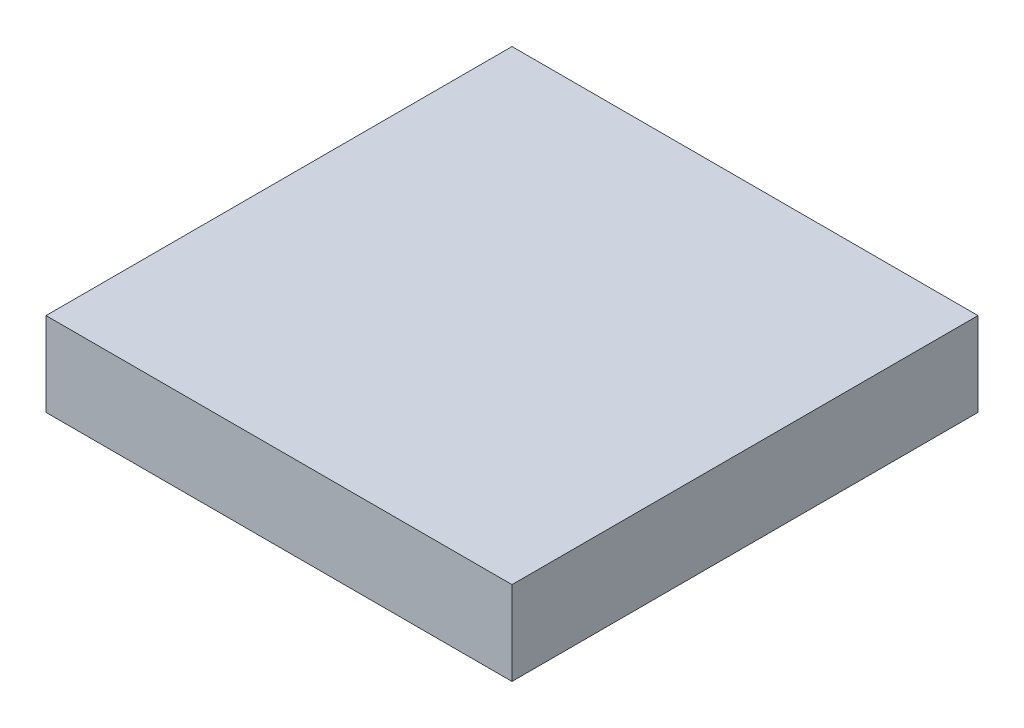
ISO-10303-21;
HEADER;
FILE_DESCRIPTION(('STEP AP214'),'2;1');
FILE_NAME('part.step','',(''),(''),'','','');
FILE_SCHEMA(('AUTOMOTIVE_DESIGN { 1 0 10303 214 1 1 1 1 }'));
ENDSEC;
DATA;
#1=APPLICATION_CONTEXT('core data for automotive mechanical design processes');
#2=APPLICATION_PROTOCOL_DEFINITION('international standard','automotive_design',2000,#1);
#3=PRODUCT_CONTEXT('',#1,'mechanical');
#4=PRODUCT('Part','Part','',(#3));
#5=PRODUCT_RELATED_PRODUCT_CATEGORY('part','',(#4));
#6=PRODUCT_DEFINITION_FORMATION('','',#4);
#7=PRODUCT_DEFINITION_CONTEXT('part definition',#1,'design');
#8=PRODUCT_DEFINITION('design','',#6,#7);
#9=PRODUCT_DEFINITION_SHAPE('','',#8);
#10=(LENGTH_UNIT() NAMED_UNIT(*) SI_UNIT(.MILLI.,.METRE.));
#11=(NAMED_UNIT(*) PLANE_ANGLE_UNIT() SI_UNIT($,.RADIAN.));
#12=(NAMED_UNIT(*) SI_UNIT($,.STERADIAN.) SOLID_ANGLE_UNIT());
#13=UNCERTAINTY_MEASURE_WITH_UNIT(LENGTH_MEASURE(1.E-05),#10,'distance_accuracy_value','');
#14=(GEOMETRIC_REPRESENTATION_CONTEXT(3) GLOBAL_UNCERTAINTY_ASSIGNED_CONTEXT((#13)) GLOBAL_UNIT_ASSIGNED_CONTEXT((#10,
#11,#12)) REPRESENTATION_CONTEXT('',''));
#15=CARTESIAN_POINT('',(0.,0.,0.));
#16=DIRECTION('',(0.,0.,1.));
#17=DIRECTION('',(1.,0.,0.));
#18=AXIS2_PLACEMENT_3D('',#15,#16,#17);
#19=CARTESIAN_POINT('',(12.5,4.5,12.5));
#20=DIRECTION('',(-1.,0.,0.));
#21=DIRECTION('',(0.,0.,1.));
#22=AXIS2_PLACEMENT_3D('',#19,#20,#21);
#23=PLANE('',#22);
#24=DIRECTION('',(0.,0.,-1.));
#25=VECTOR('',#24,1.);
#26=CARTESIAN_POINT('',(12.5,0.,12.5));
#27=LINE('',#26,#25);
#28=CARTESIAN_POINT('',(12.5,0.,12.5));
#29=VERTEX_POINT('',#28);
#30=CARTESIAN_POINT('',(12.5,0.,-12.5));
#31=VERTEX_POINT('',#30);
#32=EDGE_CURVE('E111',#29,#31,#27,.T.);
#33=ORIENTED_EDGE('',*,*,#32,.T.);
#34=DIRECTION('',(0.,-1.,0.));
#35=VECTOR('',#34,1.);
#36=CARTESIAN_POINT('',(12.5,4.5,-12.5));
#37=LINE('',#36,#35);
#38=CARTESIAN_POINT('',(12.5,4.5,-12.5));
#39=VERTEX_POINT('',#38);
#40=EDGE_CURVE('E11',#39,#31,#37,.T.);
#41=ORIENTED_EDGE('',*,*,#40,.F.);
#42=DIRECTION('',(0.,0.,-1.));
#43=VECTOR('',#42,1.);
#44=CARTESIAN_POINT('',(12.5,4.5,12.5));
#45=LINE('',#44,#43);
#46=CARTESIAN_POINT('',(12.5,4.5,12.5));
#47=VERTEX_POINT('',#46);
#48=EDGE_CURVE('E95',#47,#39,#45,.T.);
#49=ORIENTED_EDGE('',*,*,#48,.F.);
#50=DIRECTION('',(0.,-1.,0.));
#51=VECTOR('',#50,1.);
#52=CARTESIAN_POINT('',(12.5,4.5,12.5));
#53=LINE('',#52,#51);
#54=EDGE_CURVE('E107',#47,#29,#53,.T.);
#55=ORIENTED_EDGE('',*,*,#54,.T.);
#56=EDGE_LOOP('',(#33,#41,#49,#55));
#57=FACE_BOUND('',#56,.T.);
#58=ADVANCED_FACE('F43',(#57),#23,.F.);
#59=CARTESIAN_POINT('',(-12.5,4.5,-12.5));
#60=DIRECTION('',(0.,0.,1.));
#61=DIRECTION('',(1.,0.,0.));
#62=AXIS2_PLACEMENT_3D('',#59,#60,#61);
#63=PLANE('',#62);
#64=DIRECTION('',(-1.,0.,0.));
#65=VECTOR('',#64,1.);
#66=CARTESIAN_POINT('',(-12.5,0.,-12.5));
#67=LINE('',#66,#65);
#68=CARTESIAN_POINT('',(-12.5,0.,-12.5));
#69=VERTEX_POINT('',#68);
#70=EDGE_CURVE('E100',#31,#69,#67,.T.);
#71=ORIENTED_EDGE('',*,*,#70,.T.);
#72=DIRECTION('',(0.,-1.,0.));
#73=VECTOR('',#72,1.);
#74=CARTESIAN_POINT('',(-12.5,4.5,-12.5));
#75=LINE('',#74,#73);
#76=CARTESIAN_POINT('',(-12.5,4.5,-12.5));
#77=VERTEX_POINT('',#76);
#78=EDGE_CURVE('E52',#77,#69,#75,.T.);
#79=ORIENTED_EDGE('',*,*,#78,.F.);
#80=DIRECTION('',(-1.,0.,0.));
#81=VECTOR('',#80,1.);
#82=CARTESIAN_POINT('',(-12.5,4.5,-12.5));
#83=LINE('',#82,#81);
#84=EDGE_CURVE('E90',#39,#77,#83,.T.);
#85=ORIENTED_EDGE('',*,*,#84,.F.);
#86=ORIENTED_EDGE('',*,*,#40,.T.);
#87=EDGE_LOOP('',(#71,#79,#85,#86));
#88=FACE_BOUND('',#87,.T.);
#89=ADVANCED_FACE('F99',(#88),#63,.F.);
#90=CARTESIAN_POINT('',(-12.5,4.5,12.5));
#91=DIRECTION('',(1.,0.,0.));
#92=DIRECTION('',(0.,0.,-1.));
#93=AXIS2_PLACEMENT_3D('',#90,#91,#92);
#94=PLANE('',#93);
#95=DIRECTION('',(0.,0.,1.));
#96=VECTOR('',#95,1.);
#97=CARTESIAN_POINT('',(-12.5,0.,12.5));
#98=LINE('',#97,#96);
#99=CARTESIAN_POINT('',(-12.5,0.,12.5));
#100=VERTEX_POINT('',#99);
#101=EDGE_CURVE('E77',#69,#100,#98,.T.);
#102=ORIENTED_EDGE('',*,*,#101,.T.);
#103=DIRECTION('',(0.,-1.,0.));
#104=VECTOR('',#103,1.);
#105=CARTESIAN_POINT('',(-12.5,4.5,12.5));
#106=LINE('',#105,#104);
#107=CARTESIAN_POINT('',(-12.5,4.5,12.5));
#108=VERTEX_POINT('',#107);
#109=EDGE_CURVE('E102',#108,#100,#106,.T.);
#110=ORIENTED_EDGE('',*,*,#109,.F.);
#111=DIRECTION('',(0.,0.,1.));
#112=VECTOR('',#111,1.);
#113=CARTESIAN_POINT('',(-12.5,4.5,12.5));
#114=LINE('',#113,#112);
#115=EDGE_CURVE('E93',#77,#108,#114,.T.);
#116=ORIENTED_EDGE('',*,*,#115,.F.);
#117=ORIENTED_EDGE('',*,*,#78,.T.);
#118=EDGE_LOOP('',(#102,#110,#116,#117));
#119=FACE_BOUND('',#118,.T.);
#120=ADVANCED_FACE('F103',(#119),#94,.F.);
#121=CARTESIAN_POINT('',(-12.5,4.5,12.5));
#122=DIRECTION('',(0.,0.,-1.));
#123=DIRECTION('',(-1.,0.,0.));
#124=AXIS2_PLACEMENT_3D('',#121,#122,#123);
#125=PLANE('',#124);
#126=DIRECTION('',(1.,0.,0.));
#127=VECTOR('',#126,1.);
#128=CARTESIAN_POINT('',(-12.5,0.,12.5));
#129=LINE('',#128,#127);
#130=EDGE_CURVE('E83',#100,#29,#129,.T.);
#131=ORIENTED_EDGE('',*,*,#130,.T.);
#132=ORIENTED_EDGE('',*,*,#54,.F.);
#133=DIRECTION('',(1.,0.,0.));
#134=VECTOR('',#133,1.);
#135=CARTESIAN_POINT('',(-12.5,4.5,12.5));
#136=LINE('',#135,#134);
#137=EDGE_CURVE('E60',#108,#47,#136,.T.);
#138=ORIENTED_EDGE('',*,*,#137,.F.);
#139=ORIENTED_EDGE('',*,*,#109,.T.);
#140=EDGE_LOOP('',(#131,#132,#138,#139));
#141=FACE_BOUND('',#140,.T.);
#142=ADVANCED_FACE('F124',(#141),#125,.F.);
#143=CARTESIAN_POINT('',(0.,4.5,0.));
#144=DIRECTION('',(0.,-1.,0.));
#145=DIRECTION('',(0.,0.,-1.));
#146=AXIS2_PLACEMENT_3D('',#143,#144,#145);
#147=PLANE('',#146);
#148=ORIENTED_EDGE('',*,*,#48,.T.);
#149=ORIENTED_EDGE('',*,*,#84,.T.);
#150=ORIENTED_EDGE('',*,*,#115,.T.);
#151=ORIENTED_EDGE('',*,*,#137,.T.);
#152=EDGE_LOOP('',(#148,#149,#150,#151));
#153=FACE_BOUND('',#152,.T.);
#154=ADVANCED_FACE('F91',(#153),#147,.F.);
#155=CARTESIAN_POINT('',(0.,0.,0.));
#156=DIRECTION('',(0.,-1.,0.));
#157=DIRECTION('',(0.,0.,-1.));
#158=AXIS2_PLACEMENT_3D('',#155,#156,#157);
#159=PLANE('',#158);
#160=ORIENTED_EDGE('',*,*,#32,.F.);
#161=ORIENTED_EDGE('',*,*,#130,.F.);
#162=ORIENTED_EDGE('',*,*,#101,.F.);
#163=ORIENTED_EDGE('',*,*,#70,.F.);
#164=EDGE_LOOP('',(#160,#161,#162,#163));
#165=FACE_BOUND('',#164,.T.);
#166=ADVANCED_FACE('F127',(#165),#159,.T.);
#167=CLOSED_SHELL('',(#58,#89,#120,#142,#154,#166));
#168=MANIFOLD_SOLID_BREP('B2',#167);
#169=ADVANCED_BREP_SHAPE_REPRESENTATION('',(#18,#168),#14);
#170=SHAPE_DEFINITION_REPRESENTATION(#9,#169);
ENDSEC;
END-ISO-10303-21;
